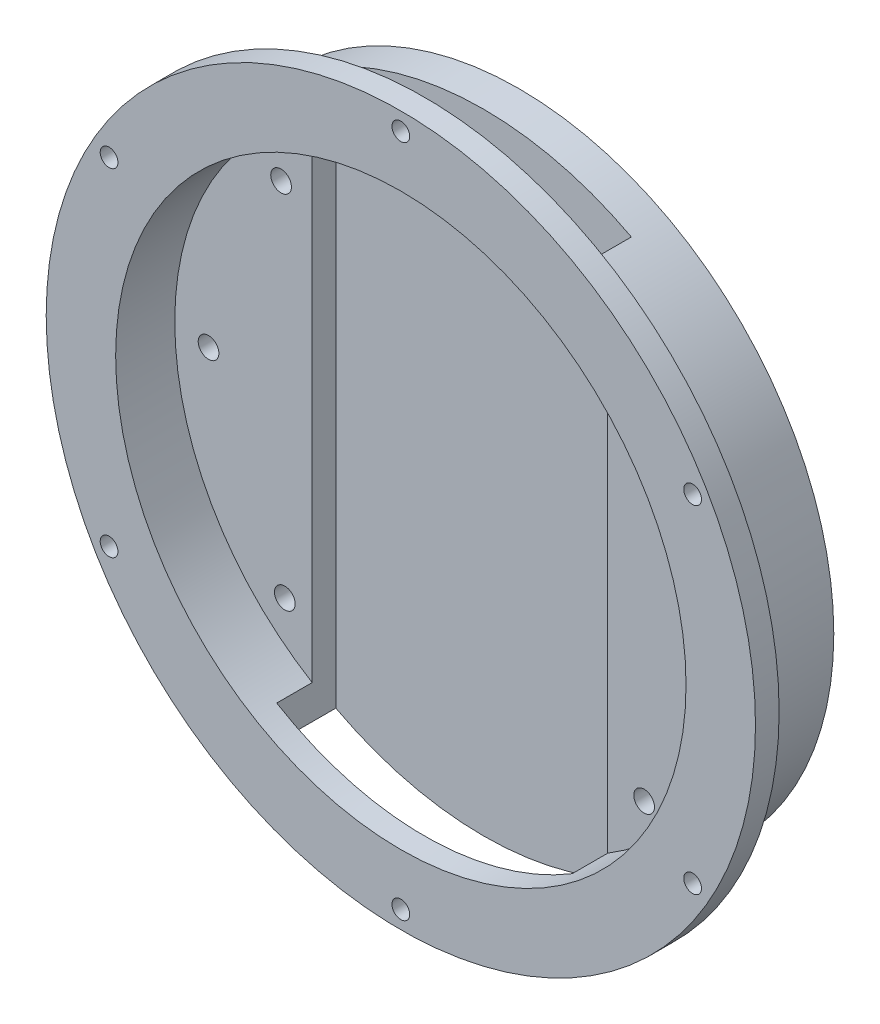
ISO-10303-21;
HEADER;
FILE_DESCRIPTION(('STEP AP214'),'2;1');
FILE_NAME('part.step','',(''),(''),'','','');
FILE_SCHEMA(('AUTOMOTIVE_DESIGN { 1 0 10303 214 1 1 1 1 }'));
ENDSEC;
DATA;
#1=APPLICATION_CONTEXT('core data for automotive mechanical design processes');
#2=APPLICATION_PROTOCOL_DEFINITION('international standard','automotive_design',2000,#1);
#3=PRODUCT_CONTEXT('',#1,'mechanical');
#4=PRODUCT('Part','Part','',(#3));
#5=PRODUCT_RELATED_PRODUCT_CATEGORY('part','',(#4));
#6=PRODUCT_DEFINITION_FORMATION('','',#4);
#7=PRODUCT_DEFINITION_CONTEXT('part definition',#1,'design');
#8=PRODUCT_DEFINITION('design','',#6,#7);
#9=PRODUCT_DEFINITION_SHAPE('','',#8);
#10=(LENGTH_UNIT() NAMED_UNIT(*) SI_UNIT(.MILLI.,.METRE.));
#11=(NAMED_UNIT(*) PLANE_ANGLE_UNIT() SI_UNIT($,.RADIAN.));
#12=(NAMED_UNIT(*) SI_UNIT($,.STERADIAN.) SOLID_ANGLE_UNIT());
#13=UNCERTAINTY_MEASURE_WITH_UNIT(LENGTH_MEASURE(1.E-05),#10,'distance_accuracy_value','');
#14=(GEOMETRIC_REPRESENTATION_CONTEXT(3) GLOBAL_UNCERTAINTY_ASSIGNED_CONTEXT((#13)) GLOBAL_UNIT_ASSIGNED_CONTEXT((#10,
#11,#12)) REPRESENTATION_CONTEXT('',''));
#15=CARTESIAN_POINT('',(0.,0.,0.));
#16=DIRECTION('',(0.,0.,1.));
#17=DIRECTION('',(1.,0.,0.));
#18=AXIS2_PLACEMENT_3D('',#15,#16,#17);
#19=CARTESIAN_POINT('',(0.,0.,0.));
#20=DIRECTION('',(0.,0.,1.));
#21=DIRECTION('',(1.,0.,0.));
#22=AXIS2_PLACEMENT_3D('',#19,#20,#21);
#23=PLANE('',#22);
#24=DIRECTION('',(0.,1.,0.));
#25=VECTOR('',#24,1.);
#26=CARTESIAN_POINT('',(25.,0.,0.));
#27=LINE('',#26,#25);
#28=CARTESIAN_POINT('',(25.,-41.2681778129348,0.));
#29=VERTEX_POINT('',#28);
#30=CARTESIAN_POINT('',(25.,41.2681778129348,0.));
#31=VERTEX_POINT('',#30);
#32=EDGE_CURVE('E146',#29,#31,#27,.T.);
#33=ORIENTED_EDGE('',*,*,#32,.F.);
#34=CARTESIAN_POINT('',(0.,0.,0.));
#35=DIRECTION('',(0.,0.,1.));
#36=DIRECTION('',(1.,0.,0.));
#37=AXIS2_PLACEMENT_3D('',#34,#35,#36);
#38=CIRCLE('',#37,48.25);
#39=EDGE_CURVE('E136',#29,#31,#38,.T.);
#40=ORIENTED_EDGE('',*,*,#39,.T.);
#41=EDGE_LOOP('',(#33,#40));
#42=FACE_BOUND('',#41,.T.);
#43=CARTESIAN_POINT('',(43.4313041027898,-0.0328709527134288,0.));
#44=DIRECTION('',(0.,0.,1.));
#45=DIRECTION('',(1.,0.,0.));
#46=AXIS2_PLACEMENT_3D('',#43,#44,#45);
#47=CIRCLE('',#46,1.75);
#48=CARTESIAN_POINT('',(45.1813041027898,-0.0328709527134288,0.));
#49=VERTEX_POINT('',#48);
#50=EDGE_CURVE('E202',#49,#49,#47,.T.);
#51=ORIENTED_EDGE('',*,*,#50,.F.);
#52=EDGE_LOOP('',(#51));
#53=FACE_BOUND('',#52,.T.);
#54=CARTESIAN_POINT('',(31.1597862218959,-30.5573690017476,0.));
#55=DIRECTION('',(0.,0.,1.));
#56=DIRECTION('',(1.,0.,0.));
#57=AXIS2_PLACEMENT_3D('',#54,#55,#56);
#58=CIRCLE('',#57,1.75);
#59=CARTESIAN_POINT('',(32.9097862218959,-30.5573690017476,0.));
#60=VERTEX_POINT('',#59);
#61=EDGE_CURVE('E198',#60,#60,#58,.T.);
#62=ORIENTED_EDGE('',*,*,#61,.F.);
#63=EDGE_LOOP('',(#62));
#64=FACE_BOUND('',#63,.T.);
#65=CARTESIAN_POINT('',(30.5244980490342,30.2284821191062,0.));
#66=DIRECTION('',(0.,0.,1.));
#67=DIRECTION('',(1.,0.,0.));
#68=AXIS2_PLACEMENT_3D('',#65,#66,#67);
#69=CIRCLE('',#68,1.75);
#70=CARTESIAN_POINT('',(32.2744980490342,30.2284821191062,0.));
#71=VERTEX_POINT('',#70);
#72=EDGE_CURVE('E216',#71,#71,#69,.T.);
#73=ORIENTED_EDGE('',*,*,#72,.F.);
#74=EDGE_LOOP('',(#73));
#75=FACE_BOUND('',#74,.T.);
#76=ADVANCED_FACE('F53',(#42,#53,#64,#75),#23,.T.);
#77=CARTESIAN_POINT('',(0.,0.,6.));
#78=DIRECTION('',(0.,0.,1.));
#79=DIRECTION('',(1.,0.,0.));
#80=AXIS2_PLACEMENT_3D('',#77,#78,#79);
#81=PLANE('',#80);
#82=DIRECTION('',(0.,1.,0.));
#83=VECTOR('',#82,1.);
#84=CARTESIAN_POINT('',(25.,-60.,6.));
#85=LINE('',#84,#83);
#86=CARTESIAN_POINT('',(25.,-47.0166194020795,6.));
#87=VERTEX_POINT('',#86);
#88=CARTESIAN_POINT('',(25.,-41.2681778129348,6.));
#89=VERTEX_POINT('',#88);
#90=EDGE_CURVE('E12',#87,#89,#85,.T.);
#91=ORIENTED_EDGE('',*,*,#90,.F.);
#92=CARTESIAN_POINT('',(0.,0.,6.));
#93=DIRECTION('',(0.,0.,1.));
#94=DIRECTION('',(1.,0.,0.));
#95=AXIS2_PLACEMENT_3D('',#92,#93,#94);
#96=CIRCLE('',#95,53.25);
#97=CARTESIAN_POINT('',(25.,47.0166194020795,6.));
#98=VERTEX_POINT('',#97);
#99=EDGE_CURVE('E243',#98,#87,#96,.F.);
#100=ORIENTED_EDGE('',*,*,#99,.F.);
#101=CARTESIAN_POINT('',(25.,41.2681778129348,6.));
#102=VERTEX_POINT('',#101);
#103=EDGE_CURVE('E66',#102,#98,#85,.T.);
#104=ORIENTED_EDGE('',*,*,#103,.F.);
#105=CARTESIAN_POINT('',(0.,0.,6.00000000000001));
#106=DIRECTION('',(0.,0.,1.));
#107=DIRECTION('',(1.,0.,0.));
#108=AXIS2_PLACEMENT_3D('',#105,#106,#107);
#109=CIRCLE('',#108,48.25);
#110=CARTESIAN_POINT('',(-25.,41.2681778129347,6.00000000000001));
#111=VERTEX_POINT('',#110);
#112=EDGE_CURVE('E127',#111,#102,#109,.F.);
#113=ORIENTED_EDGE('',*,*,#112,.F.);
#114=DIRECTION('',(0.,1.,0.));
#115=VECTOR('',#114,1.);
#116=CARTESIAN_POINT('',(-25.,-60.,6.00000000000001));
#117=LINE('',#116,#115);
#118=CARTESIAN_POINT('',(-25.,47.0166194020795,6.00000000000001));
#119=VERTEX_POINT('',#118);
#120=EDGE_CURVE('E174',#111,#119,#117,.T.);
#121=ORIENTED_EDGE('',*,*,#120,.T.);
#122=CARTESIAN_POINT('',(-25.,-47.0166194020795,6.00000000000001));
#123=VERTEX_POINT('',#122);
#124=EDGE_CURVE('E247',#123,#119,#96,.F.);
#125=ORIENTED_EDGE('',*,*,#124,.F.);
#126=CARTESIAN_POINT('',(-25.,-41.2681778129348,6.00000000000001));
#127=VERTEX_POINT('',#126);
#128=EDGE_CURVE('E121',#123,#127,#117,.T.);
#129=ORIENTED_EDGE('',*,*,#128,.T.);
#130=EDGE_CURVE('E115',#89,#127,#109,.F.);
#131=ORIENTED_EDGE('',*,*,#130,.F.);
#132=EDGE_LOOP('',(#91,#100,#104,#113,#121,#125,#129,#131));
#133=FACE_BOUND('',#132,.T.);
#134=CARTESIAN_POINT('',(3.98028872628117E-13,-57.,6.));
#135=DIRECTION('',(0.,0.,-1.));
#136=DIRECTION('',(-1.,0.,0.));
#137=AXIS2_PLACEMENT_3D('',#134,#135,#136);
#138=CIRCLE('',#137,1.5);
#139=CARTESIAN_POINT('',(-1.4999999999996,-57.,6.));
#140=VERTEX_POINT('',#139);
#141=EDGE_CURVE('E264',#140,#140,#138,.T.);
#142=ORIENTED_EDGE('',*,*,#141,.F.);
#143=EDGE_LOOP('',(#142));
#144=FACE_BOUND('',#143,.T.);
#145=CARTESIAN_POINT('',(0.,0.,6.));
#146=DIRECTION('',(0.,0.,1.));
#147=DIRECTION('',(1.,0.,0.));
#148=AXIS2_PLACEMENT_3D('',#145,#146,#147);
#149=CIRCLE('',#148,60.);
#150=CARTESIAN_POINT('',(60.,0.,6.));
#151=VERTEX_POINT('',#150);
#152=EDGE_CURVE('E153',#151,#151,#149,.T.);
#153=ORIENTED_EDGE('',*,*,#152,.F.);
#154=EDGE_LOOP('',(#153));
#155=FACE_BOUND('',#154,.T.);
#156=CARTESIAN_POINT('',(-49.3634480157129,-28.5000000000002,6.));
#157=DIRECTION('',(0.,0.,-1.));
#158=DIRECTION('',(-1.,0.,0.));
#159=AXIS2_PLACEMENT_3D('',#156,#157,#158);
#160=CIRCLE('',#159,1.5);
#161=CARTESIAN_POINT('',(-50.8634480157129,-28.5000000000002,6.));
#162=VERTEX_POINT('',#161);
#163=EDGE_CURVE('E272',#162,#162,#160,.T.);
#164=ORIENTED_EDGE('',*,*,#163,.F.);
#165=EDGE_LOOP('',(#164));
#166=FACE_BOUND('',#165,.T.);
#167=CARTESIAN_POINT('',(-49.3634480157131,28.4999999999999,6.));
#168=DIRECTION('',(0.,0.,-1.));
#169=DIRECTION('',(-1.,0.,0.));
#170=AXIS2_PLACEMENT_3D('',#167,#168,#169);
#171=CIRCLE('',#170,1.5);
#172=CARTESIAN_POINT('',(-50.8634480157131,28.4999999999999,6.));
#173=VERTEX_POINT('',#172);
#174=EDGE_CURVE('E246',#173,#173,#171,.T.);
#175=ORIENTED_EDGE('',*,*,#174,.F.);
#176=EDGE_LOOP('',(#175));
#177=FACE_BOUND('',#176,.T.);
#178=CARTESIAN_POINT('',(0.,57.,6.));
#179=DIRECTION('',(0.,0.,-1.));
#180=DIRECTION('',(-1.,0.,0.));
#181=AXIS2_PLACEMENT_3D('',#178,#179,#180);
#182=CIRCLE('',#181,1.5);
#183=CARTESIAN_POINT('',(-1.5,57.,6.));
#184=VERTEX_POINT('',#183);
#185=EDGE_CURVE('E144',#184,#184,#182,.T.);
#186=ORIENTED_EDGE('',*,*,#185,.F.);
#187=EDGE_LOOP('',(#186));
#188=FACE_BOUND('',#187,.T.);
#189=CARTESIAN_POINT('',(49.3634480157133,-28.4999999999995,6.));
#190=DIRECTION('',(0.,0.,-1.));
#191=DIRECTION('',(-1.,0.,0.));
#192=AXIS2_PLACEMENT_3D('',#189,#190,#191);
#193=CIRCLE('',#192,1.5);
#194=CARTESIAN_POINT('',(47.8634480157133,-28.4999999999995,6.));
#195=VERTEX_POINT('',#194);
#196=EDGE_CURVE('E254',#195,#195,#193,.T.);
#197=ORIENTED_EDGE('',*,*,#196,.F.);
#198=EDGE_LOOP('',(#197));
#199=FACE_BOUND('',#198,.T.);
#200=CARTESIAN_POINT('',(49.3634480157127,28.5000000000006,6.));
#201=DIRECTION('',(0.,0.,-1.));
#202=DIRECTION('',(-1.,0.,0.));
#203=AXIS2_PLACEMENT_3D('',#200,#201,#202);
#204=CIRCLE('',#203,1.5);
#205=CARTESIAN_POINT('',(47.8634480157127,28.5000000000006,6.));
#206=VERTEX_POINT('',#205);
#207=EDGE_CURVE('E263',#206,#206,#204,.T.);
#208=ORIENTED_EDGE('',*,*,#207,.F.);
#209=EDGE_LOOP('',(#208));
#210=FACE_BOUND('',#209,.T.);
#211=ADVANCED_FACE('F116',(#133,#144,#155,#166,#177,#188,#199,#210),#81,.F.);
#212=DIRECTION('',(0.,-1.,0.));
#213=VECTOR('',#212,1.);
#214=CARTESIAN_POINT('',(-25.,0.,0.));
#215=LINE('',#214,#213);
#216=CARTESIAN_POINT('',(-25.,41.2681778129348,0.));
#217=VERTEX_POINT('',#216);
#218=CARTESIAN_POINT('',(-25.,-41.2681778129348,0.));
#219=VERTEX_POINT('',#218);
#220=EDGE_CURVE('E154',#217,#219,#215,.T.);
#221=ORIENTED_EDGE('',*,*,#220,.F.);
#222=EDGE_CURVE('E238',#217,#219,#38,.T.);
#223=ORIENTED_EDGE('',*,*,#222,.T.);
#224=EDGE_LOOP('',(#221,#223));
#225=FACE_BOUND('',#224,.T.);
#226=CARTESIAN_POINT('',(-30.2613530718196,29.5931939462444,0.));
#227=DIRECTION('',(0.,0.,1.));
#228=DIRECTION('',(1.,0.,0.));
#229=AXIS2_PLACEMENT_3D('',#226,#227,#228);
#230=CIRCLE('',#229,1.75);
#231=CARTESIAN_POINT('',(-28.5113530718196,29.5931939462444,0.));
#232=VERTEX_POINT('',#231);
#233=EDGE_CURVE('E184',#232,#232,#230,.T.);
#234=ORIENTED_EDGE('',*,*,#233,.F.);
#235=EDGE_LOOP('',(#234));
#236=FACE_BOUND('',#235,.T.);
#237=CARTESIAN_POINT('',(-42.5328709527134,-0.931304102789751,0.));
#238=DIRECTION('',(0.,0.,1.));
#239=DIRECTION('',(1.,0.,0.));
#240=AXIS2_PLACEMENT_3D('',#237,#238,#239);
#241=CIRCLE('',#240,1.75);
#242=CARTESIAN_POINT('',(-40.7828709527134,-0.931304102789751,0.));
#243=VERTEX_POINT('',#242);
#244=EDGE_CURVE('E189',#243,#243,#241,.T.);
#245=ORIENTED_EDGE('',*,*,#244,.F.);
#246=EDGE_LOOP('',(#245));
#247=FACE_BOUND('',#246,.T.);
#248=CARTESIAN_POINT('',(-29.6260648989578,-31.1926571746094,0.));
#249=DIRECTION('',(0.,0.,1.));
#250=DIRECTION('',(1.,0.,0.));
#251=AXIS2_PLACEMENT_3D('',#248,#249,#250);
#252=CIRCLE('',#251,1.75);
#253=CARTESIAN_POINT('',(-27.8760648989578,-31.1926571746094,0.));
#254=VERTEX_POINT('',#253);
#255=EDGE_CURVE('E194',#254,#254,#252,.T.);
#256=ORIENTED_EDGE('',*,*,#255,.F.);
#257=EDGE_LOOP('',(#256));
#258=FACE_BOUND('',#257,.T.);
#259=ADVANCED_FACE('F306',(#225,#236,#247,#258),#23,.T.);
#260=CARTESIAN_POINT('',(0.,0.,10.));
#261=DIRECTION('',(0.,0.,-1.));
#262=DIRECTION('',(-1.,0.,0.));
#263=AXIS2_PLACEMENT_3D('',#260,#261,#262);
#264=PLANE('',#263);
#265=CARTESIAN_POINT('',(0.,57.,10.));
#266=DIRECTION('',(0.,0.,-1.));
#267=DIRECTION('',(-1.,0.,0.));
#268=AXIS2_PLACEMENT_3D('',#265,#266,#267);
#269=CIRCLE('',#268,1.5);
#270=CARTESIAN_POINT('',(-1.5,57.,10.));
#271=VERTEX_POINT('',#270);
#272=EDGE_CURVE('E292',#271,#271,#269,.F.);
#273=ORIENTED_EDGE('',*,*,#272,.F.);
#274=EDGE_LOOP('',(#273));
#275=FACE_BOUND('',#274,.T.);
#276=CARTESIAN_POINT('',(49.3634480157127,28.5000000000006,10.));
#277=DIRECTION('',(0.,0.,-1.));
#278=DIRECTION('',(-1.,0.,0.));
#279=AXIS2_PLACEMENT_3D('',#276,#277,#278);
#280=CIRCLE('',#279,1.5);
#281=CARTESIAN_POINT('',(47.8634480157127,28.5000000000006,10.));
#282=VERTEX_POINT('',#281);
#283=EDGE_CURVE('E289',#282,#282,#280,.F.);
#284=ORIENTED_EDGE('',*,*,#283,.F.);
#285=EDGE_LOOP('',(#284));
#286=FACE_BOUND('',#285,.T.);
#287=CARTESIAN_POINT('',(49.3634480157133,-28.4999999999995,10.));
#288=DIRECTION('',(0.,0.,-1.));
#289=DIRECTION('',(-1.,0.,0.));
#290=AXIS2_PLACEMENT_3D('',#287,#288,#289);
#291=CIRCLE('',#290,1.5);
#292=CARTESIAN_POINT('',(47.8634480157133,-28.4999999999995,10.));
#293=VERTEX_POINT('',#292);
#294=EDGE_CURVE('E258',#293,#293,#291,.F.);
#295=ORIENTED_EDGE('',*,*,#294,.F.);
#296=EDGE_LOOP('',(#295));
#297=FACE_BOUND('',#296,.T.);
#298=CARTESIAN_POINT('',(3.98028872628117E-13,-57.,10.));
#299=DIRECTION('',(0.,0.,-1.));
#300=DIRECTION('',(-1.,0.,0.));
#301=AXIS2_PLACEMENT_3D('',#298,#299,#300);
#302=CIRCLE('',#301,1.5);
#303=CARTESIAN_POINT('',(-1.4999999999996,-57.,10.));
#304=VERTEX_POINT('',#303);
#305=EDGE_CURVE('E259',#304,#304,#302,.F.);
#306=ORIENTED_EDGE('',*,*,#305,.F.);
#307=EDGE_LOOP('',(#306));
#308=FACE_BOUND('',#307,.T.);
#309=CARTESIAN_POINT('',(-49.3634480157129,-28.5000000000002,10.));
#310=DIRECTION('',(0.,0.,-1.));
#311=DIRECTION('',(-1.,0.,0.));
#312=AXIS2_PLACEMENT_3D('',#309,#310,#311);
#313=CIRCLE('',#312,1.5);
#314=CARTESIAN_POINT('',(-50.8634480157129,-28.5000000000002,10.));
#315=VERTEX_POINT('',#314);
#316=EDGE_CURVE('E268',#315,#315,#313,.F.);
#317=ORIENTED_EDGE('',*,*,#316,.F.);
#318=EDGE_LOOP('',(#317));
#319=FACE_BOUND('',#318,.T.);
#320=CARTESIAN_POINT('',(-49.3634480157131,28.4999999999999,10.));
#321=DIRECTION('',(0.,0.,-1.));
#322=DIRECTION('',(-1.,0.,0.));
#323=AXIS2_PLACEMENT_3D('',#320,#321,#322);
#324=CIRCLE('',#323,1.5);
#325=CARTESIAN_POINT('',(-50.8634480157131,28.4999999999999,10.));
#326=VERTEX_POINT('',#325);
#327=EDGE_CURVE('E276',#326,#326,#324,.F.);
#328=ORIENTED_EDGE('',*,*,#327,.F.);
#329=EDGE_LOOP('',(#328));
#330=FACE_BOUND('',#329,.T.);
#331=CARTESIAN_POINT('',(0.,0.,10.));
#332=DIRECTION('',(0.,0.,-1.));
#333=DIRECTION('',(-1.,0.,0.));
#334=AXIS2_PLACEMENT_3D('',#331,#332,#333);
#335=CIRCLE('',#334,48.25);
#336=CARTESIAN_POINT('',(-48.25,0.,10.));
#337=VERTEX_POINT('',#336);
#338=EDGE_CURVE('E239',#337,#337,#335,.T.);
#339=ORIENTED_EDGE('',*,*,#338,.T.);
#340=EDGE_LOOP('',(#339));
#341=FACE_BOUND('',#340,.T.);
#342=CARTESIAN_POINT('',(0.,0.,10.));
#343=DIRECTION('',(0.,0.,1.));
#344=DIRECTION('',(1.,0.,0.));
#345=AXIS2_PLACEMENT_3D('',#342,#343,#344);
#346=CIRCLE('',#345,60.);
#347=CARTESIAN_POINT('',(60.,0.,10.));
#348=VERTEX_POINT('',#347);
#349=EDGE_CURVE('E163',#348,#348,#346,.T.);
#350=ORIENTED_EDGE('',*,*,#349,.T.);
#351=EDGE_LOOP('',(#350));
#352=FACE_BOUND('',#351,.T.);
#353=ADVANCED_FACE('F319',(#275,#286,#297,#308,#319,#330,#341,#352),#264,.F.);
#354=CARTESIAN_POINT('',(0.,0.,10.));
#355=DIRECTION('',(0.,0.,-1.));
#356=DIRECTION('',(-1.,0.,0.));
#357=AXIS2_PLACEMENT_3D('',#354,#355,#356);
#358=CYLINDRICAL_SURFACE('',#357,48.25);
#359=ORIENTED_EDGE('',*,*,#338,.F.);
#360=EDGE_LOOP('',(#359));
#361=FACE_BOUND('',#360,.T.);
#362=ORIENTED_EDGE('',*,*,#112,.T.);
#363=DIRECTION('',(0.,0.,-1.));
#364=VECTOR('',#363,1.);
#365=CARTESIAN_POINT('',(25.,41.2681778129348,9.99999999999998));
#366=LINE('',#365,#364);
#367=EDGE_CURVE('E138',#102,#31,#366,.T.);
#368=ORIENTED_EDGE('',*,*,#367,.T.);
#369=ORIENTED_EDGE('',*,*,#39,.F.);
#370=DIRECTION('',(0.,0.,-1.));
#371=VECTOR('',#370,1.);
#372=CARTESIAN_POINT('',(25.,-41.2681778129348,9.99999999999998));
#373=LINE('',#372,#371);
#374=EDGE_CURVE('E72',#29,#89,#373,.F.);
#375=ORIENTED_EDGE('',*,*,#374,.T.);
#376=ORIENTED_EDGE('',*,*,#130,.T.);
#377=DIRECTION('',(0.,0.,-1.));
#378=VECTOR('',#377,1.);
#379=CARTESIAN_POINT('',(-25.,-41.2681778129348,10.));
#380=LINE('',#379,#378);
#381=EDGE_CURVE('E125',#127,#219,#380,.T.);
#382=ORIENTED_EDGE('',*,*,#381,.T.);
#383=ORIENTED_EDGE('',*,*,#222,.F.);
#384=DIRECTION('',(0.,0.,-1.));
#385=VECTOR('',#384,1.);
#386=CARTESIAN_POINT('',(-25.,41.2681778129348,10.));
#387=LINE('',#386,#385);
#388=EDGE_CURVE('E149',#217,#111,#387,.F.);
#389=ORIENTED_EDGE('',*,*,#388,.T.);
#390=EDGE_LOOP('',(#362,#368,#369,#375,#376,#382,#383,#389));
#391=FACE_BOUND('',#390,.T.);
#392=ADVANCED_FACE('F133',(#361,#391),#358,.F.);
#393=CARTESIAN_POINT('',(0.,0.,6.));
#394=DIRECTION('',(0.,0.,1.));
#395=DIRECTION('',(1.,0.,0.));
#396=AXIS2_PLACEMENT_3D('',#393,#394,#395);
#397=CYLINDRICAL_SURFACE('',#396,60.);
#398=ORIENTED_EDGE('',*,*,#152,.T.);
#399=EDGE_LOOP('',(#398));
#400=FACE_BOUND('',#399,.T.);
#401=ORIENTED_EDGE('',*,*,#349,.F.);
#402=EDGE_LOOP('',(#401));
#403=FACE_BOUND('',#402,.T.);
#404=ADVANCED_FACE('F336',(#400,#403),#397,.T.);
#405=CARTESIAN_POINT('',(0.,0.,10.));
#406=DIRECTION('',(0.,0.,-1.));
#407=DIRECTION('',(-1.,0.,0.));
#408=AXIS2_PLACEMENT_3D('',#405,#406,#407);
#409=CYLINDRICAL_SURFACE('',#408,53.25);
#410=DIRECTION('',(0.,0.,-1.));
#411=VECTOR('',#410,1.);
#412=CARTESIAN_POINT('',(25.,-47.0166194020795,9.99999999999998));
#413=LINE('',#412,#411);
#414=CARTESIAN_POINT('',(25.,-47.0166194020795,-3.99999999999999));
#415=VERTEX_POINT('',#414);
#416=EDGE_CURVE('E64',#415,#87,#413,.F.);
#417=ORIENTED_EDGE('',*,*,#416,.F.);
#418=CARTESIAN_POINT('',(0.,0.,-3.99999999999999));
#419=DIRECTION('',(0.,0.,-1.));
#420=DIRECTION('',(-1.,0.,0.));
#421=AXIS2_PLACEMENT_3D('',#418,#419,#420);
#422=CIRCLE('',#421,53.25);
#423=CARTESIAN_POINT('',(-25.,-47.0166194020795,-3.99999999999999));
#424=VERTEX_POINT('',#423);
#425=EDGE_CURVE('E168',#424,#415,#422,.F.);
#426=ORIENTED_EDGE('',*,*,#425,.F.);
#427=DIRECTION('',(0.,0.,-1.));
#428=VECTOR('',#427,1.);
#429=CARTESIAN_POINT('',(-25.,-47.0166194020795,10.));
#430=LINE('',#429,#428);
#431=EDGE_CURVE('E158',#123,#424,#430,.T.);
#432=ORIENTED_EDGE('',*,*,#431,.F.);
#433=ORIENTED_EDGE('',*,*,#124,.T.);
#434=DIRECTION('',(0.,0.,-1.));
#435=VECTOR('',#434,1.);
#436=CARTESIAN_POINT('',(-25.,47.0166194020795,10.));
#437=LINE('',#436,#435);
#438=CARTESIAN_POINT('',(-25.,47.0166194020795,-3.99999999999999));
#439=VERTEX_POINT('',#438);
#440=EDGE_CURVE('E173',#439,#119,#437,.F.);
#441=ORIENTED_EDGE('',*,*,#440,.F.);
#442=CARTESIAN_POINT('',(25.,47.0166194020795,-3.99999999999999));
#443=VERTEX_POINT('',#442);
#444=EDGE_CURVE('E159',#443,#439,#422,.F.);
#445=ORIENTED_EDGE('',*,*,#444,.F.);
#446=DIRECTION('',(0.,0.,-1.));
#447=VECTOR('',#446,1.);
#448=CARTESIAN_POINT('',(25.,47.0166194020795,9.99999999999998));
#449=LINE('',#448,#447);
#450=EDGE_CURVE('E179',#98,#443,#449,.T.);
#451=ORIENTED_EDGE('',*,*,#450,.F.);
#452=ORIENTED_EDGE('',*,*,#99,.T.);
#453=EDGE_LOOP('',(#417,#426,#432,#433,#441,#445,#451,#452));
#454=FACE_BOUND('',#453,.T.);
#455=CARTESIAN_POINT('',(0.,0.,-10.));
#456=DIRECTION('',(0.,0.,-1.));
#457=DIRECTION('',(-1.,0.,0.));
#458=AXIS2_PLACEMENT_3D('',#455,#456,#457);
#459=CIRCLE('',#458,53.25);
#460=CARTESIAN_POINT('',(-53.25,0.,-10.));
#461=VERTEX_POINT('',#460);
#462=EDGE_CURVE('E220',#461,#461,#459,.T.);
#463=ORIENTED_EDGE('',*,*,#462,.F.);
#464=EDGE_LOOP('',(#463));
#465=FACE_BOUND('',#464,.T.);
#466=ADVANCED_FACE('F338',(#454,#465),#409,.T.);
#467=CARTESIAN_POINT('',(-49.3634480157131,28.4999999999999,15.001));
#468=DIRECTION('',(0.,0.,-1.));
#469=DIRECTION('',(-1.,0.,0.));
#470=AXIS2_PLACEMENT_3D('',#467,#468,#469);
#471=CYLINDRICAL_SURFACE('',#470,1.5);
#472=ORIENTED_EDGE('',*,*,#174,.T.);
#473=EDGE_LOOP('',(#472));
#474=FACE_BOUND('',#473,.T.);
#475=ORIENTED_EDGE('',*,*,#327,.T.);
#476=EDGE_LOOP('',(#475));
#477=FACE_BOUND('',#476,.T.);
#478=ADVANCED_FACE('F346',(#474,#477),#471,.F.);
#479=CARTESIAN_POINT('',(-49.3634480157129,-28.5000000000002,15.001));
#480=DIRECTION('',(0.,0.,-1.));
#481=DIRECTION('',(-1.,0.,0.));
#482=AXIS2_PLACEMENT_3D('',#479,#480,#481);
#483=CYLINDRICAL_SURFACE('',#482,1.5);
#484=ORIENTED_EDGE('',*,*,#163,.T.);
#485=EDGE_LOOP('',(#484));
#486=FACE_BOUND('',#485,.T.);
#487=ORIENTED_EDGE('',*,*,#316,.T.);
#488=EDGE_LOOP('',(#487));
#489=FACE_BOUND('',#488,.T.);
#490=ADVANCED_FACE('F507',(#486,#489),#483,.F.);
#491=CARTESIAN_POINT('',(3.98028872628117E-13,-57.,15.001));
#492=DIRECTION('',(0.,0.,-1.));
#493=DIRECTION('',(-1.,0.,0.));
#494=AXIS2_PLACEMENT_3D('',#491,#492,#493);
#495=CYLINDRICAL_SURFACE('',#494,1.5);
#496=ORIENTED_EDGE('',*,*,#141,.T.);
#497=EDGE_LOOP('',(#496));
#498=FACE_BOUND('',#497,.T.);
#499=ORIENTED_EDGE('',*,*,#305,.T.);
#500=EDGE_LOOP('',(#499));
#501=FACE_BOUND('',#500,.T.);
#502=ADVANCED_FACE('F498',(#498,#501),#495,.F.);
#503=CARTESIAN_POINT('',(49.3634480157133,-28.4999999999995,15.001));
#504=DIRECTION('',(0.,0.,-1.));
#505=DIRECTION('',(-1.,0.,0.));
#506=AXIS2_PLACEMENT_3D('',#503,#504,#505);
#507=CYLINDRICAL_SURFACE('',#506,1.5);
#508=ORIENTED_EDGE('',*,*,#196,.T.);
#509=EDGE_LOOP('',(#508));
#510=FACE_BOUND('',#509,.T.);
#511=ORIENTED_EDGE('',*,*,#294,.T.);
#512=EDGE_LOOP('',(#511));
#513=FACE_BOUND('',#512,.T.);
#514=ADVANCED_FACE('F315',(#510,#513),#507,.F.);
#515=CARTESIAN_POINT('',(49.3634480157127,28.5000000000006,15.001));
#516=DIRECTION('',(0.,0.,-1.));
#517=DIRECTION('',(-1.,0.,0.));
#518=AXIS2_PLACEMENT_3D('',#515,#516,#517);
#519=CYLINDRICAL_SURFACE('',#518,1.5);
#520=ORIENTED_EDGE('',*,*,#207,.T.);
#521=EDGE_LOOP('',(#520));
#522=FACE_BOUND('',#521,.T.);
#523=ORIENTED_EDGE('',*,*,#283,.T.);
#524=EDGE_LOOP('',(#523));
#525=FACE_BOUND('',#524,.T.);
#526=ADVANCED_FACE('F312',(#522,#525),#519,.F.);
#527=CARTESIAN_POINT('',(0.,57.,15.001));
#528=DIRECTION('',(0.,0.,-1.));
#529=DIRECTION('',(-1.,0.,0.));
#530=AXIS2_PLACEMENT_3D('',#527,#528,#529);
#531=CYLINDRICAL_SURFACE('',#530,1.5);
#532=ORIENTED_EDGE('',*,*,#185,.T.);
#533=EDGE_LOOP('',(#532));
#534=FACE_BOUND('',#533,.T.);
#535=ORIENTED_EDGE('',*,*,#272,.T.);
#536=EDGE_LOOP('',(#535));
#537=FACE_BOUND('',#536,.T.);
#538=ADVANCED_FACE('F302',(#534,#537),#531,.F.);
#539=CARTESIAN_POINT('',(-25.,-60.,-3.99999999999999));
#540=DIRECTION('',(0.,0.,-1.));
#541=DIRECTION('',(-1.,0.,0.));
#542=AXIS2_PLACEMENT_3D('',#539,#540,#541);
#543=PLANE('',#542);
#544=ORIENTED_EDGE('',*,*,#425,.T.);
#545=DIRECTION('',(0.,1.,0.));
#546=VECTOR('',#545,1.);
#547=CARTESIAN_POINT('',(25.,-60.,-4.));
#548=LINE('',#547,#546);
#549=EDGE_CURVE('E164',#415,#443,#548,.T.);
#550=ORIENTED_EDGE('',*,*,#549,.T.);
#551=ORIENTED_EDGE('',*,*,#444,.T.);
#552=DIRECTION('',(0.,1.,0.));
#553=VECTOR('',#552,1.);
#554=CARTESIAN_POINT('',(-25.,-60.,-3.99999999999999));
#555=LINE('',#554,#553);
#556=EDGE_CURVE('E169',#424,#439,#555,.T.);
#557=ORIENTED_EDGE('',*,*,#556,.F.);
#558=EDGE_LOOP('',(#544,#550,#551,#557));
#559=FACE_BOUND('',#558,.T.);
#560=ADVANCED_FACE('F470',(#559),#543,.F.);
#561=CARTESIAN_POINT('',(-25.,-60.,-3.99999999999999));
#562=DIRECTION('',(-1.,0.,0.));
#563=DIRECTION('',(0.,0.,1.));
#564=AXIS2_PLACEMENT_3D('',#561,#562,#563);
#565=PLANE('',#564);
#566=ORIENTED_EDGE('',*,*,#220,.T.);
#567=ORIENTED_EDGE('',*,*,#381,.F.);
#568=ORIENTED_EDGE('',*,*,#128,.F.);
#569=ORIENTED_EDGE('',*,*,#431,.T.);
#570=ORIENTED_EDGE('',*,*,#556,.T.);
#571=ORIENTED_EDGE('',*,*,#440,.T.);
#572=ORIENTED_EDGE('',*,*,#120,.F.);
#573=ORIENTED_EDGE('',*,*,#388,.F.);
#574=EDGE_LOOP('',(#566,#567,#568,#569,#570,#571,#572,#573));
#575=FACE_BOUND('',#574,.T.);
#576=ADVANCED_FACE('F55',(#575),#565,.F.);
#577=CARTESIAN_POINT('',(25.,-60.,-4.));
#578=DIRECTION('',(1.,0.,0.));
#579=DIRECTION('',(0.,0.,-1.));
#580=AXIS2_PLACEMENT_3D('',#577,#578,#579);
#581=PLANE('',#580);
#582=ORIENTED_EDGE('',*,*,#32,.T.);
#583=ORIENTED_EDGE('',*,*,#367,.F.);
#584=ORIENTED_EDGE('',*,*,#103,.T.);
#585=ORIENTED_EDGE('',*,*,#450,.T.);
#586=ORIENTED_EDGE('',*,*,#549,.F.);
#587=ORIENTED_EDGE('',*,*,#416,.T.);
#588=ORIENTED_EDGE('',*,*,#90,.T.);
#589=ORIENTED_EDGE('',*,*,#374,.F.);
#590=EDGE_LOOP('',(#582,#583,#584,#585,#586,#587,#588,#589));
#591=FACE_BOUND('',#590,.T.);
#592=ADVANCED_FACE('F128',(#591),#581,.F.);
#593=CARTESIAN_POINT('',(0.,0.,-10.));
#594=DIRECTION('',(0.,0.,-1.));
#595=DIRECTION('',(-1.,0.,0.));
#596=AXIS2_PLACEMENT_3D('',#593,#594,#595);
#597=PLANE('',#596);
#598=CARTESIAN_POINT('',(30.5244980490342,30.2284821191062,-10.));
#599=DIRECTION('',(0.,0.,-1.));
#600=DIRECTION('',(-1.,0.,0.));
#601=AXIS2_PLACEMENT_3D('',#598,#599,#600);
#602=CIRCLE('',#601,1.75);
#603=CARTESIAN_POINT('',(28.7744980490342,30.2284821191062,-10.));
#604=VERTEX_POINT('',#603);
#605=EDGE_CURVE('E57',#604,#604,#602,.T.);
#606=ORIENTED_EDGE('',*,*,#605,.F.);
#607=EDGE_LOOP('',(#606));
#608=FACE_BOUND('',#607,.T.);
#609=CARTESIAN_POINT('',(43.4313041027898,-0.0328709527134288,-10.));
#610=DIRECTION('',(0.,0.,-1.));
#611=DIRECTION('',(-1.,0.,0.));
#612=AXIS2_PLACEMENT_3D('',#609,#610,#611);
#613=CIRCLE('',#612,1.75);
#614=CARTESIAN_POINT('',(41.6813041027898,-0.0328709527134288,-10.));
#615=VERTEX_POINT('',#614);
#616=EDGE_CURVE('E199',#615,#615,#613,.T.);
#617=ORIENTED_EDGE('',*,*,#616,.F.);
#618=EDGE_LOOP('',(#617));
#619=FACE_BOUND('',#618,.T.);
#620=CARTESIAN_POINT('',(31.1597862218959,-30.5573690017476,-10.));
#621=DIRECTION('',(0.,0.,-1.));
#622=DIRECTION('',(-1.,0.,0.));
#623=AXIS2_PLACEMENT_3D('',#620,#621,#622);
#624=CIRCLE('',#623,1.75);
#625=CARTESIAN_POINT('',(29.4097862218959,-30.5573690017476,-10.));
#626=VERTEX_POINT('',#625);
#627=EDGE_CURVE('E195',#626,#626,#624,.T.);
#628=ORIENTED_EDGE('',*,*,#627,.F.);
#629=EDGE_LOOP('',(#628));
#630=FACE_BOUND('',#629,.T.);
#631=CARTESIAN_POINT('',(-29.6260648989578,-31.1926571746094,-10.));
#632=DIRECTION('',(0.,0.,-1.));
#633=DIRECTION('',(-1.,0.,0.));
#634=AXIS2_PLACEMENT_3D('',#631,#632,#633);
#635=CIRCLE('',#634,1.75);
#636=CARTESIAN_POINT('',(-31.3760648989578,-31.1926571746094,-10.));
#637=VERTEX_POINT('',#636);
#638=EDGE_CURVE('E190',#637,#637,#635,.T.);
#639=ORIENTED_EDGE('',*,*,#638,.F.);
#640=EDGE_LOOP('',(#639));
#641=FACE_BOUND('',#640,.T.);
#642=CARTESIAN_POINT('',(-42.5328709527134,-0.931304102789751,-10.));
#643=DIRECTION('',(0.,0.,-1.));
#644=DIRECTION('',(-1.,0.,0.));
#645=AXIS2_PLACEMENT_3D('',#642,#643,#644);
#646=CIRCLE('',#645,1.75);
#647=CARTESIAN_POINT('',(-44.2828709527134,-0.931304102789751,-10.));
#648=VERTEX_POINT('',#647);
#649=EDGE_CURVE('E185',#648,#648,#646,.T.);
#650=ORIENTED_EDGE('',*,*,#649,.F.);
#651=EDGE_LOOP('',(#650));
#652=FACE_BOUND('',#651,.T.);
#653=CARTESIAN_POINT('',(-30.2613530718196,29.5931939462444,-10.));
#654=DIRECTION('',(0.,0.,-1.));
#655=DIRECTION('',(-1.,0.,0.));
#656=AXIS2_PLACEMENT_3D('',#653,#654,#655);
#657=CIRCLE('',#656,1.75);
#658=CARTESIAN_POINT('',(-32.0113530718196,29.5931939462444,-10.));
#659=VERTEX_POINT('',#658);
#660=EDGE_CURVE('E180',#659,#659,#657,.T.);
#661=ORIENTED_EDGE('',*,*,#660,.F.);
#662=EDGE_LOOP('',(#661));
#663=FACE_BOUND('',#662,.T.);
#664=ORIENTED_EDGE('',*,*,#462,.T.);
#665=EDGE_LOOP('',(#664));
#666=FACE_BOUND('',#665,.T.);
#667=ADVANCED_FACE('F384',(#608,#619,#630,#641,#652,#663,#666),#597,.T.);
#668=CARTESIAN_POINT('',(-30.2613530718196,29.5931939462444,15.));
#669=DIRECTION('',(0.,0.,-1.));
#670=DIRECTION('',(-1.,0.,0.));
#671=AXIS2_PLACEMENT_3D('',#668,#669,#670);
#672=CYLINDRICAL_SURFACE('',#671,1.75);
#673=ORIENTED_EDGE('',*,*,#233,.T.);
#674=EDGE_LOOP('',(#673));
#675=FACE_BOUND('',#674,.T.);
#676=ORIENTED_EDGE('',*,*,#660,.T.);
#677=EDGE_LOOP('',(#676));
#678=FACE_BOUND('',#677,.T.);
#679=ADVANCED_FACE('F380',(#675,#678),#672,.F.);
#680=CARTESIAN_POINT('',(-42.5328709527134,-0.931304102789751,15.));
#681=DIRECTION('',(0.,0.,-1.));
#682=DIRECTION('',(-1.,0.,0.));
#683=AXIS2_PLACEMENT_3D('',#680,#681,#682);
#684=CYLINDRICAL_SURFACE('',#683,1.75);
#685=ORIENTED_EDGE('',*,*,#244,.T.);
#686=EDGE_LOOP('',(#685));
#687=FACE_BOUND('',#686,.T.);
#688=ORIENTED_EDGE('',*,*,#649,.T.);
#689=EDGE_LOOP('',(#688));
#690=FACE_BOUND('',#689,.T.);
#691=ADVANCED_FACE('F383',(#687,#690),#684,.F.);
#692=CARTESIAN_POINT('',(-29.6260648989578,-31.1926571746094,15.));
#693=DIRECTION('',(0.,0.,-1.));
#694=DIRECTION('',(-1.,0.,0.));
#695=AXIS2_PLACEMENT_3D('',#692,#693,#694);
#696=CYLINDRICAL_SURFACE('',#695,1.75);
#697=ORIENTED_EDGE('',*,*,#255,.T.);
#698=EDGE_LOOP('',(#697));
#699=FACE_BOUND('',#698,.T.);
#700=ORIENTED_EDGE('',*,*,#638,.T.);
#701=EDGE_LOOP('',(#700));
#702=FACE_BOUND('',#701,.T.);
#703=ADVANCED_FACE('F411',(#699,#702),#696,.F.);
#704=CARTESIAN_POINT('',(31.1597862218959,-30.5573690017476,15.));
#705=DIRECTION('',(0.,0.,-1.));
#706=DIRECTION('',(-1.,0.,0.));
#707=AXIS2_PLACEMENT_3D('',#704,#705,#706);
#708=CYLINDRICAL_SURFACE('',#707,1.75);
#709=ORIENTED_EDGE('',*,*,#61,.T.);
#710=EDGE_LOOP('',(#709));
#711=FACE_BOUND('',#710,.T.);
#712=ORIENTED_EDGE('',*,*,#627,.T.);
#713=EDGE_LOOP('',(#712));
#714=FACE_BOUND('',#713,.T.);
#715=ADVANCED_FACE('F407',(#711,#714),#708,.F.);
#716=CARTESIAN_POINT('',(43.4313041027898,-0.0328709527134288,15.));
#717=DIRECTION('',(0.,0.,-1.));
#718=DIRECTION('',(-1.,0.,0.));
#719=AXIS2_PLACEMENT_3D('',#716,#717,#718);
#720=CYLINDRICAL_SURFACE('',#719,1.75);
#721=ORIENTED_EDGE('',*,*,#50,.T.);
#722=EDGE_LOOP('',(#721));
#723=FACE_BOUND('',#722,.T.);
#724=ORIENTED_EDGE('',*,*,#616,.T.);
#725=EDGE_LOOP('',(#724));
#726=FACE_BOUND('',#725,.T.);
#727=ADVANCED_FACE('F403',(#723,#726),#720,.F.);
#728=CARTESIAN_POINT('',(30.5244980490342,30.2284821191062,15.));
#729=DIRECTION('',(0.,0.,-1.));
#730=DIRECTION('',(-1.,0.,0.));
#731=AXIS2_PLACEMENT_3D('',#728,#729,#730);
#732=CYLINDRICAL_SURFACE('',#731,1.75);
#733=ORIENTED_EDGE('',*,*,#72,.T.);
#734=EDGE_LOOP('',(#733));
#735=FACE_BOUND('',#734,.T.);
#736=ORIENTED_EDGE('',*,*,#605,.T.);
#737=EDGE_LOOP('',(#736));
#738=FACE_BOUND('',#737,.T.);
#739=ADVANCED_FACE('F400',(#735,#738),#732,.F.);
#740=CLOSED_SHELL('',(#76,#211,#259,#353,#392,#404,#466,#478,#490,#502,#514,#526,#538,#560,#576,
#592,#667,#679,#691,#703,#715,#727,#739));
#741=MANIFOLD_SOLID_BREP('B2',#740);
#742=ADVANCED_BREP_SHAPE_REPRESENTATION('',(#18,#741),#14);
#743=SHAPE_DEFINITION_REPRESENTATION(#9,#742);
ENDSEC;
END-ISO-10303-21;
